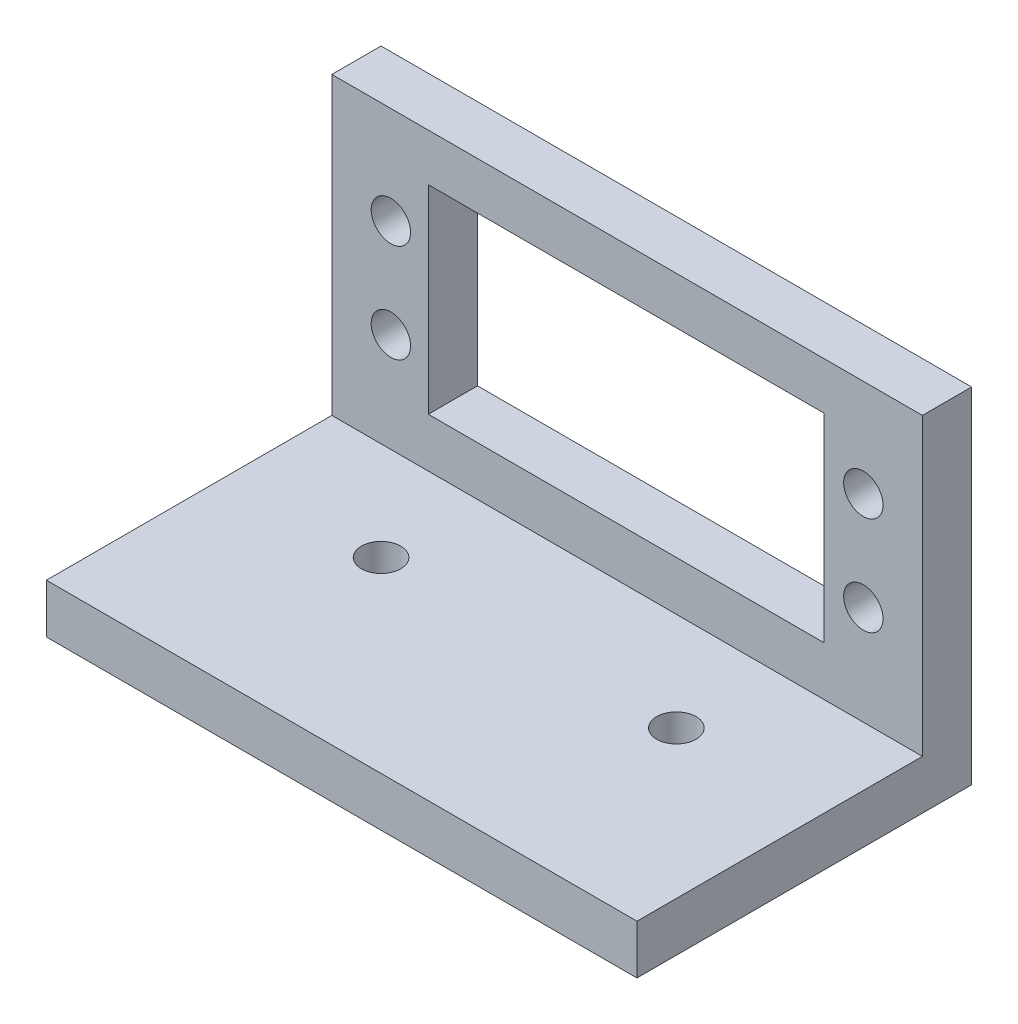
ISO-10303-21;
HEADER;
FILE_DESCRIPTION(('STEP AP214'),'2;1');
FILE_NAME('part.step','',(''),(''),'','','');
FILE_SCHEMA(('AUTOMOTIVE_DESIGN { 1 0 10303 214 1 1 1 1 }'));
ENDSEC;
DATA;
#1=APPLICATION_CONTEXT('core data for automotive mechanical design processes');
#2=APPLICATION_PROTOCOL_DEFINITION('international standard','automotive_design',2000,#1);
#3=PRODUCT_CONTEXT('',#1,'mechanical');
#4=PRODUCT('Part','Part','',(#3));
#5=PRODUCT_RELATED_PRODUCT_CATEGORY('part','',(#4));
#6=PRODUCT_DEFINITION_FORMATION('','',#4);
#7=PRODUCT_DEFINITION_CONTEXT('part definition',#1,'design');
#8=PRODUCT_DEFINITION('design','',#6,#7);
#9=PRODUCT_DEFINITION_SHAPE('','',#8);
#10=(LENGTH_UNIT() NAMED_UNIT(*) SI_UNIT(.MILLI.,.METRE.));
#11=(NAMED_UNIT(*) PLANE_ANGLE_UNIT() SI_UNIT($,.RADIAN.));
#12=(NAMED_UNIT(*) SI_UNIT($,.STERADIAN.) SOLID_ANGLE_UNIT());
#13=UNCERTAINTY_MEASURE_WITH_UNIT(LENGTH_MEASURE(1.E-05),#10,'distance_accuracy_value','');
#14=(GEOMETRIC_REPRESENTATION_CONTEXT(3) GLOBAL_UNCERTAINTY_ASSIGNED_CONTEXT((#13)) GLOBAL_UNIT_ASSIGNED_CONTEXT((#10,
#11,#12)) REPRESENTATION_CONTEXT('',''));
#15=CARTESIAN_POINT('',(0.,0.,0.));
#16=DIRECTION('',(0.,0.,1.));
#17=DIRECTION('',(1.,0.,0.));
#18=AXIS2_PLACEMENT_3D('',#15,#16,#17);
#19=CARTESIAN_POINT('',(0.,0.,5.));
#20=DIRECTION('',(0.,0.,1.));
#21=DIRECTION('',(1.,0.,0.));
#22=AXIS2_PLACEMENT_3D('',#19,#20,#21);
#23=PLANE('',#22);
#24=CARTESIAN_POINT('',(-26.0999999999999,5.60138495733142,5.));
#25=DIRECTION('',(0.,0.,1.));
#26=DIRECTION('',(1.,0.,0.));
#27=AXIS2_PLACEMENT_3D('',#24,#25,#26);
#28=CIRCLE('',#27,2.);
#29=CARTESIAN_POINT('',(-24.0999999999999,5.60138495733142,5.));
#30=VERTEX_POINT('',#29);
#31=EDGE_CURVE('E454',#30,#30,#28,.T.);
#32=ORIENTED_EDGE('',*,*,#31,.F.);
#33=EDGE_LOOP('',(#32));
#34=FACE_BOUND('',#33,.T.);
#35=CARTESIAN_POINT('',(-26.0999999999999,-4.39861504266858,5.));
#36=DIRECTION('',(0.,0.,1.));
#37=DIRECTION('',(1.,0.,0.));
#38=AXIS2_PLACEMENT_3D('',#35,#36,#37);
#39=CIRCLE('',#38,2.);
#40=CARTESIAN_POINT('',(-24.0999999999999,-4.39861504266858,5.));
#41=VERTEX_POINT('',#40);
#42=EDGE_CURVE('E458',#41,#41,#39,.T.);
#43=ORIENTED_EDGE('',*,*,#42,.F.);
#44=EDGE_LOOP('',(#43));
#45=FACE_BOUND('',#44,.T.);
#46=CARTESIAN_POINT('',(21.9000000000001,-4.39861504266858,5.));
#47=DIRECTION('',(0.,0.,1.));
#48=DIRECTION('',(1.,0.,0.));
#49=AXIS2_PLACEMENT_3D('',#46,#47,#48);
#50=CIRCLE('',#49,2.);
#51=CARTESIAN_POINT('',(23.9000000000001,-4.39861504266858,5.));
#52=VERTEX_POINT('',#51);
#53=EDGE_CURVE('E472',#52,#52,#50,.T.);
#54=ORIENTED_EDGE('',*,*,#53,.F.);
#55=EDGE_LOOP('',(#54));
#56=FACE_BOUND('',#55,.T.);
#57=CARTESIAN_POINT('',(21.9000000000001,5.60138495733142,5.));
#58=DIRECTION('',(0.,0.,1.));
#59=DIRECTION('',(1.,0.,0.));
#60=AXIS2_PLACEMENT_3D('',#57,#58,#59);
#61=CIRCLE('',#60,2.);
#62=CARTESIAN_POINT('',(23.9000000000001,5.60138495733142,5.));
#63=VERTEX_POINT('',#62);
#64=EDGE_CURVE('E239',#63,#63,#61,.T.);
#65=ORIENTED_EDGE('',*,*,#64,.F.);
#66=EDGE_LOOP('',(#65));
#67=FACE_BOUND('',#66,.T.);
#68=DIRECTION('',(-1.,0.,0.));
#69=VECTOR('',#68,1.);
#70=CARTESIAN_POINT('',(-32.0999999999998,-14.4986150426686,5.));
#71=LINE('',#70,#69);
#72=CARTESIAN_POINT('',(27.9000000000001,-14.4986150426686,5.));
#73=VERTEX_POINT('',#72);
#74=CARTESIAN_POINT('',(-32.0999999999998,-14.4986150426686,5.));
#75=VERTEX_POINT('',#74);
#76=EDGE_CURVE('E57',#73,#75,#71,.T.);
#77=ORIENTED_EDGE('',*,*,#76,.F.);
#78=DIRECTION('',(0.,1.,0.));
#79=VECTOR('',#78,1.);
#80=CARTESIAN_POINT('',(27.9000000000001,15.5013849573314,5.));
#81=LINE('',#80,#79);
#82=CARTESIAN_POINT('',(27.9000000000001,15.5013849573314,5.));
#83=VERTEX_POINT('',#82);
#84=EDGE_CURVE('E198',#73,#83,#81,.T.);
#85=ORIENTED_EDGE('',*,*,#84,.T.);
#86=DIRECTION('',(-1.,0.,0.));
#87=VECTOR('',#86,1.);
#88=CARTESIAN_POINT('',(-32.0999999999998,15.5013849573314,5.));
#89=LINE('',#88,#87);
#90=CARTESIAN_POINT('',(-32.0999999999998,15.5013849573314,5.));
#91=VERTEX_POINT('',#90);
#92=EDGE_CURVE('E121',#83,#91,#89,.T.);
#93=ORIENTED_EDGE('',*,*,#92,.T.);
#94=DIRECTION('',(0.,-1.,0.));
#95=VECTOR('',#94,1.);
#96=CARTESIAN_POINT('',(-32.0999999999998,15.5013849573314,5.));
#97=LINE('',#96,#95);
#98=EDGE_CURVE('E117',#91,#75,#97,.T.);
#99=ORIENTED_EDGE('',*,*,#98,.T.);
#100=EDGE_LOOP('',(#77,#85,#93,#99));
#101=FACE_BOUND('',#100,.T.);
#102=DIRECTION('',(-1.,0.,0.));
#103=VECTOR('',#102,1.);
#104=CARTESIAN_POINT('',(-22.2999999999999,10.7013849573314,5.));
#105=LINE('',#104,#103);
#106=CARTESIAN_POINT('',(17.9000000000001,10.7013849573314,5.));
#107=VERTEX_POINT('',#106);
#108=CARTESIAN_POINT('',(-22.2999999999999,10.7013849573314,5.));
#109=VERTEX_POINT('',#108);
#110=EDGE_CURVE('E159',#107,#109,#105,.T.);
#111=ORIENTED_EDGE('',*,*,#110,.F.);
#112=DIRECTION('',(0.,1.,0.));
#113=VECTOR('',#112,1.);
#114=CARTESIAN_POINT('',(17.9000000000001,10.7013849573314,5.));
#115=LINE('',#114,#113);
#116=CARTESIAN_POINT('',(17.9000000000001,-9.49861504266863,5.));
#117=VERTEX_POINT('',#116);
#118=EDGE_CURVE('E156',#117,#107,#115,.T.);
#119=ORIENTED_EDGE('',*,*,#118,.F.);
#120=DIRECTION('',(1.,0.,0.));
#121=VECTOR('',#120,1.);
#122=CARTESIAN_POINT('',(-22.2999999999999,-9.49861504266863,5.));
#123=LINE('',#122,#121);
#124=CARTESIAN_POINT('',(-22.2999999999999,-9.49861504266863,5.));
#125=VERTEX_POINT('',#124);
#126=EDGE_CURVE('E166',#125,#117,#123,.T.);
#127=ORIENTED_EDGE('',*,*,#126,.F.);
#128=DIRECTION('',(0.,-1.,0.));
#129=VECTOR('',#128,1.);
#130=CARTESIAN_POINT('',(-22.2999999999999,10.7013849573314,5.));
#131=LINE('',#130,#129);
#132=EDGE_CURVE('E163',#109,#125,#131,.T.);
#133=ORIENTED_EDGE('',*,*,#132,.F.);
#134=EDGE_LOOP('',(#111,#119,#127,#133));
#135=FACE_BOUND('',#134,.T.);
#136=ADVANCED_FACE('F39',(#34,#45,#56,#67,#101,#135),#23,.T.);
#137=CARTESIAN_POINT('',(0.,0.,0.));
#138=DIRECTION('',(0.,0.,1.));
#139=DIRECTION('',(1.,0.,0.));
#140=AXIS2_PLACEMENT_3D('',#137,#138,#139);
#141=PLANE('',#140);
#142=CARTESIAN_POINT('',(-26.0999999999999,5.60138495733142,0.));
#143=DIRECTION('',(0.,0.,1.));
#144=DIRECTION('',(1.,0.,0.));
#145=AXIS2_PLACEMENT_3D('',#142,#143,#144);
#146=CIRCLE('',#145,2.);
#147=CARTESIAN_POINT('',(-24.0999999999999,5.60138495733142,0.));
#148=VERTEX_POINT('',#147);
#149=EDGE_CURVE('E452',#148,#148,#146,.T.);
#150=ORIENTED_EDGE('',*,*,#149,.T.);
#151=EDGE_LOOP('',(#150));
#152=FACE_BOUND('',#151,.T.);
#153=CARTESIAN_POINT('',(-26.0999999999999,-4.39861504266858,0.));
#154=DIRECTION('',(0.,0.,1.));
#155=DIRECTION('',(1.,0.,0.));
#156=AXIS2_PLACEMENT_3D('',#153,#154,#155);
#157=CIRCLE('',#156,2.);
#158=CARTESIAN_POINT('',(-24.0999999999999,-4.39861504266858,0.));
#159=VERTEX_POINT('',#158);
#160=EDGE_CURVE('E478',#159,#159,#157,.T.);
#161=ORIENTED_EDGE('',*,*,#160,.T.);
#162=EDGE_LOOP('',(#161));
#163=FACE_BOUND('',#162,.T.);
#164=CARTESIAN_POINT('',(21.9000000000001,-4.39861504266858,0.));
#165=DIRECTION('',(0.,0.,1.));
#166=DIRECTION('',(1.,0.,0.));
#167=AXIS2_PLACEMENT_3D('',#164,#165,#166);
#168=CIRCLE('',#167,2.);
#169=CARTESIAN_POINT('',(23.9000000000001,-4.39861504266858,0.));
#170=VERTEX_POINT('',#169);
#171=EDGE_CURVE('E467',#170,#170,#168,.T.);
#172=ORIENTED_EDGE('',*,*,#171,.T.);
#173=EDGE_LOOP('',(#172));
#174=FACE_BOUND('',#173,.T.);
#175=CARTESIAN_POINT('',(21.9000000000001,5.60138495733142,0.));
#176=DIRECTION('',(0.,0.,1.));
#177=DIRECTION('',(1.,0.,0.));
#178=AXIS2_PLACEMENT_3D('',#175,#176,#177);
#179=CIRCLE('',#178,2.);
#180=CARTESIAN_POINT('',(23.9000000000001,5.60138495733142,0.));
#181=VERTEX_POINT('',#180);
#182=EDGE_CURVE('E236',#181,#181,#179,.T.);
#183=ORIENTED_EDGE('',*,*,#182,.T.);
#184=EDGE_LOOP('',(#183));
#185=FACE_BOUND('',#184,.T.);
#186=DIRECTION('',(0.,1.,0.));
#187=VECTOR('',#186,1.);
#188=CARTESIAN_POINT('',(27.9000000000001,15.5013849573314,0.));
#189=LINE('',#188,#187);
#190=CARTESIAN_POINT('',(27.9000000000001,-19.4986150426686,0.));
#191=VERTEX_POINT('',#190);
#192=CARTESIAN_POINT('',(27.9000000000001,15.5013849573314,0.));
#193=VERTEX_POINT('',#192);
#194=EDGE_CURVE('E197',#191,#193,#189,.T.);
#195=ORIENTED_EDGE('',*,*,#194,.F.);
#196=DIRECTION('',(1.,0.,0.));
#197=VECTOR('',#196,1.);
#198=CARTESIAN_POINT('',(-32.0999999999998,-19.4986150426686,0.));
#199=LINE('',#198,#197);
#200=CARTESIAN_POINT('',(-32.0999999999998,-19.4986150426686,0.));
#201=VERTEX_POINT('',#200);
#202=EDGE_CURVE('E201',#201,#191,#199,.T.);
#203=ORIENTED_EDGE('',*,*,#202,.F.);
#204=DIRECTION('',(0.,-1.,0.));
#205=VECTOR('',#204,1.);
#206=CARTESIAN_POINT('',(-32.0999999999998,15.5013849573314,0.));
#207=LINE('',#206,#205);
#208=CARTESIAN_POINT('',(-32.0999999999998,15.5013849573314,0.));
#209=VERTEX_POINT('',#208);
#210=EDGE_CURVE('E210',#209,#201,#207,.T.);
#211=ORIENTED_EDGE('',*,*,#210,.F.);
#212=DIRECTION('',(-1.,0.,0.));
#213=VECTOR('',#212,1.);
#214=CARTESIAN_POINT('',(-32.0999999999998,15.5013849573314,0.));
#215=LINE('',#214,#213);
#216=EDGE_CURVE('E207',#193,#209,#215,.T.);
#217=ORIENTED_EDGE('',*,*,#216,.F.);
#218=EDGE_LOOP('',(#195,#203,#211,#217));
#219=FACE_BOUND('',#218,.T.);
#220=DIRECTION('',(0.,1.,0.));
#221=VECTOR('',#220,1.);
#222=CARTESIAN_POINT('',(17.9000000000001,10.7013849573314,0.));
#223=LINE('',#222,#221);
#224=CARTESIAN_POINT('',(17.9000000000001,-9.49861504266863,0.));
#225=VERTEX_POINT('',#224);
#226=CARTESIAN_POINT('',(17.9000000000001,10.7013849573314,0.));
#227=VERTEX_POINT('',#226);
#228=EDGE_CURVE('E170',#225,#227,#223,.T.);
#229=ORIENTED_EDGE('',*,*,#228,.T.);
#230=DIRECTION('',(-1.,0.,0.));
#231=VECTOR('',#230,1.);
#232=CARTESIAN_POINT('',(-22.2999999999999,10.7013849573314,0.));
#233=LINE('',#232,#231);
#234=CARTESIAN_POINT('',(-22.2999999999999,10.7013849573314,0.));
#235=VERTEX_POINT('',#234);
#236=EDGE_CURVE('E174',#227,#235,#233,.T.);
#237=ORIENTED_EDGE('',*,*,#236,.T.);
#238=DIRECTION('',(0.,-1.,0.));
#239=VECTOR('',#238,1.);
#240=CARTESIAN_POINT('',(-22.2999999999999,10.7013849573314,0.));
#241=LINE('',#240,#239);
#242=CARTESIAN_POINT('',(-22.2999999999999,-9.49861504266863,0.));
#243=VERTEX_POINT('',#242);
#244=EDGE_CURVE('E178',#235,#243,#241,.T.);
#245=ORIENTED_EDGE('',*,*,#244,.T.);
#246=DIRECTION('',(1.,0.,0.));
#247=VECTOR('',#246,1.);
#248=CARTESIAN_POINT('',(-22.2999999999999,-9.49861504266863,0.));
#249=LINE('',#248,#247);
#250=EDGE_CURVE('E160',#243,#225,#249,.T.);
#251=ORIENTED_EDGE('',*,*,#250,.T.);
#252=EDGE_LOOP('',(#229,#237,#245,#251));
#253=FACE_BOUND('',#252,.T.);
#254=ADVANCED_FACE('F261',(#152,#163,#174,#185,#219,#253),#141,.F.);
#255=CARTESIAN_POINT('',(27.9000000000001,15.5013849573314,5.));
#256=DIRECTION('',(-1.,0.,0.));
#257=DIRECTION('',(0.,-1.,0.));
#258=AXIS2_PLACEMENT_3D('',#255,#256,#257);
#259=PLANE('',#258);
#260=ORIENTED_EDGE('',*,*,#194,.T.);
#261=DIRECTION('',(0.,0.,-1.));
#262=VECTOR('',#261,1.);
#263=CARTESIAN_POINT('',(27.9000000000001,15.5013849573314,5.));
#264=LINE('',#263,#262);
#265=EDGE_CURVE('E11',#83,#193,#264,.T.);
#266=ORIENTED_EDGE('',*,*,#265,.F.);
#267=ORIENTED_EDGE('',*,*,#84,.F.);
#268=DIRECTION('',(0.,0.,-1.));
#269=VECTOR('',#268,1.);
#270=CARTESIAN_POINT('',(27.9000000000001,-14.4986150426686,94.2079728939614));
#271=LINE('',#270,#269);
#272=CARTESIAN_POINT('',(27.9000000000001,-14.4986150426686,34.));
#273=VERTEX_POINT('',#272);
#274=EDGE_CURVE('E137',#273,#73,#271,.T.);
#275=ORIENTED_EDGE('',*,*,#274,.F.);
#276=DIRECTION('',(0.,-1.,0.));
#277=VECTOR('',#276,1.);
#278=CARTESIAN_POINT('',(27.9000000000001,-19.4986150426686,34.));
#279=LINE('',#278,#277);
#280=CARTESIAN_POINT('',(27.9000000000001,-19.4986150426686,34.));
#281=VERTEX_POINT('',#280);
#282=EDGE_CURVE('E155',#273,#281,#279,.T.);
#283=ORIENTED_EDGE('',*,*,#282,.T.);
#284=DIRECTION('',(0.,0.,-1.));
#285=VECTOR('',#284,1.);
#286=CARTESIAN_POINT('',(27.9000000000001,-19.4986150426686,5.));
#287=LINE('',#286,#285);
#288=EDGE_CURVE('E126',#281,#191,#287,.T.);
#289=ORIENTED_EDGE('',*,*,#288,.T.);
#290=EDGE_LOOP('',(#260,#266,#267,#275,#283,#289));
#291=FACE_BOUND('',#290,.T.);
#292=ADVANCED_FACE('F41',(#291),#259,.F.);
#293=CARTESIAN_POINT('',(-32.0999999999998,15.5013849573314,5.));
#294=DIRECTION('',(0.,-1.,0.));
#295=DIRECTION('',(0.,0.,-1.));
#296=AXIS2_PLACEMENT_3D('',#293,#294,#295);
#297=PLANE('',#296);
#298=ORIENTED_EDGE('',*,*,#216,.T.);
#299=DIRECTION('',(0.,0.,-1.));
#300=VECTOR('',#299,1.);
#301=CARTESIAN_POINT('',(-32.0999999999998,15.5013849573314,5.));
#302=LINE('',#301,#300);
#303=EDGE_CURVE('E49',#91,#209,#302,.T.);
#304=ORIENTED_EDGE('',*,*,#303,.F.);
#305=ORIENTED_EDGE('',*,*,#92,.F.);
#306=ORIENTED_EDGE('',*,*,#265,.T.);
#307=EDGE_LOOP('',(#298,#304,#305,#306));
#308=FACE_BOUND('',#307,.T.);
#309=ADVANCED_FACE('F258',(#308),#297,.F.);
#310=CARTESIAN_POINT('',(-32.0999999999998,15.5013849573314,5.));
#311=DIRECTION('',(1.,0.,0.));
#312=DIRECTION('',(0.,1.,0.));
#313=AXIS2_PLACEMENT_3D('',#310,#311,#312);
#314=PLANE('',#313);
#315=ORIENTED_EDGE('',*,*,#210,.T.);
#316=DIRECTION('',(0.,0.,-1.));
#317=VECTOR('',#316,1.);
#318=CARTESIAN_POINT('',(-32.0999999999998,-19.4986150426686,5.));
#319=LINE('',#318,#317);
#320=CARTESIAN_POINT('',(-32.0999999999998,-19.4986150426686,34.));
#321=VERTEX_POINT('',#320);
#322=EDGE_CURVE('E218',#321,#201,#319,.T.);
#323=ORIENTED_EDGE('',*,*,#322,.F.);
#324=DIRECTION('',(0.,1.,0.));
#325=VECTOR('',#324,1.);
#326=CARTESIAN_POINT('',(-32.0999999999998,-19.4986150426686,34.));
#327=LINE('',#326,#325);
#328=CARTESIAN_POINT('',(-32.0999999999998,-14.4986150426686,34.));
#329=VERTEX_POINT('',#328);
#330=EDGE_CURVE('E133',#321,#329,#327,.T.);
#331=ORIENTED_EDGE('',*,*,#330,.T.);
#332=DIRECTION('',(0.,0.,-1.));
#333=VECTOR('',#332,1.);
#334=CARTESIAN_POINT('',(-32.0999999999998,-14.4986150426686,94.2079728939614));
#335=LINE('',#334,#333);
#336=EDGE_CURVE('E130',#329,#75,#335,.T.);
#337=ORIENTED_EDGE('',*,*,#336,.T.);
#338=ORIENTED_EDGE('',*,*,#98,.F.);
#339=ORIENTED_EDGE('',*,*,#303,.T.);
#340=EDGE_LOOP('',(#315,#323,#331,#337,#338,#339));
#341=FACE_BOUND('',#340,.T.);
#342=ADVANCED_FACE('F131',(#341),#314,.F.);
#343=CARTESIAN_POINT('',(-32.0999999999998,-19.4986150426686,5.));
#344=DIRECTION('',(0.,1.,0.));
#345=DIRECTION('',(-1.,0.,0.));
#346=AXIS2_PLACEMENT_3D('',#343,#344,#345);
#347=PLANE('',#346);
#348=CARTESIAN_POINT('',(-17.0999999999999,-19.4986150426686,15.));
#349=DIRECTION('',(0.,-1.,0.));
#350=DIRECTION('',(0.,0.,-1.));
#351=AXIS2_PLACEMENT_3D('',#348,#349,#350);
#352=CIRCLE('',#351,2.);
#353=CARTESIAN_POINT('',(-17.0999999999999,-19.4986150426686,13.));
#354=VERTEX_POINT('',#353);
#355=EDGE_CURVE('E225',#354,#354,#352,.T.);
#356=ORIENTED_EDGE('',*,*,#355,.F.);
#357=EDGE_LOOP('',(#356));
#358=FACE_BOUND('',#357,.T.);
#359=CARTESIAN_POINT('',(12.9000000000001,-19.4986150426686,15.));
#360=DIRECTION('',(0.,-1.,0.));
#361=DIRECTION('',(0.,0.,-1.));
#362=AXIS2_PLACEMENT_3D('',#359,#360,#361);
#363=CIRCLE('',#362,2.);
#364=CARTESIAN_POINT('',(12.9000000000001,-19.4986150426686,13.));
#365=VERTEX_POINT('',#364);
#366=EDGE_CURVE('E230',#365,#365,#363,.T.);
#367=ORIENTED_EDGE('',*,*,#366,.F.);
#368=EDGE_LOOP('',(#367));
#369=FACE_BOUND('',#368,.T.);
#370=ORIENTED_EDGE('',*,*,#202,.T.);
#371=ORIENTED_EDGE('',*,*,#288,.F.);
#372=DIRECTION('',(-1.,0.,0.));
#373=VECTOR('',#372,1.);
#374=CARTESIAN_POINT('',(-32.0999999999998,-19.4986150426686,34.));
#375=LINE('',#374,#373);
#376=EDGE_CURVE('E244',#281,#321,#375,.T.);
#377=ORIENTED_EDGE('',*,*,#376,.T.);
#378=ORIENTED_EDGE('',*,*,#322,.T.);
#379=EDGE_LOOP('',(#370,#371,#377,#378));
#380=FACE_BOUND('',#379,.T.);
#381=ADVANCED_FACE('F250',(#358,#369,#380),#347,.F.);
#382=CARTESIAN_POINT('',(17.9000000000001,10.7013849573314,5.));
#383=DIRECTION('',(-1.,0.,0.));
#384=DIRECTION('',(0.,-1.,0.));
#385=AXIS2_PLACEMENT_3D('',#382,#383,#384);
#386=PLANE('',#385);
#387=ORIENTED_EDGE('',*,*,#228,.F.);
#388=DIRECTION('',(0.,0.,-1.));
#389=VECTOR('',#388,1.);
#390=CARTESIAN_POINT('',(17.9000000000001,-9.49861504266863,5.));
#391=LINE('',#390,#389);
#392=EDGE_CURVE('E169',#117,#225,#391,.T.);
#393=ORIENTED_EDGE('',*,*,#392,.F.);
#394=ORIENTED_EDGE('',*,*,#118,.T.);
#395=DIRECTION('',(0.,0.,-1.));
#396=VECTOR('',#395,1.);
#397=CARTESIAN_POINT('',(17.9000000000001,10.7013849573314,5.));
#398=LINE('',#397,#396);
#399=EDGE_CURVE('E193',#107,#227,#398,.T.);
#400=ORIENTED_EDGE('',*,*,#399,.T.);
#401=EDGE_LOOP('',(#387,#393,#394,#400));
#402=FACE_BOUND('',#401,.T.);
#403=ADVANCED_FACE('F268',(#402),#386,.T.);
#404=CARTESIAN_POINT('',(-22.2999999999999,10.7013849573314,5.));
#405=DIRECTION('',(0.,-1.,0.));
#406=DIRECTION('',(0.,0.,-1.));
#407=AXIS2_PLACEMENT_3D('',#404,#405,#406);
#408=PLANE('',#407);
#409=ORIENTED_EDGE('',*,*,#236,.F.);
#410=ORIENTED_EDGE('',*,*,#399,.F.);
#411=ORIENTED_EDGE('',*,*,#110,.T.);
#412=DIRECTION('',(0.,0.,-1.));
#413=VECTOR('',#412,1.);
#414=CARTESIAN_POINT('',(-22.2999999999999,10.7013849573314,5.));
#415=LINE('',#414,#413);
#416=EDGE_CURVE('E190',#109,#235,#415,.T.);
#417=ORIENTED_EDGE('',*,*,#416,.T.);
#418=EDGE_LOOP('',(#409,#410,#411,#417));
#419=FACE_BOUND('',#418,.T.);
#420=ADVANCED_FACE('F276',(#419),#408,.T.);
#421=CARTESIAN_POINT('',(-22.2999999999999,10.7013849573314,5.));
#422=DIRECTION('',(1.,0.,0.));
#423=DIRECTION('',(0.,1.,0.));
#424=AXIS2_PLACEMENT_3D('',#421,#422,#423);
#425=PLANE('',#424);
#426=ORIENTED_EDGE('',*,*,#244,.F.);
#427=ORIENTED_EDGE('',*,*,#416,.F.);
#428=ORIENTED_EDGE('',*,*,#132,.T.);
#429=DIRECTION('',(0.,0.,-1.));
#430=VECTOR('',#429,1.);
#431=CARTESIAN_POINT('',(-22.2999999999999,-9.49861504266863,5.));
#432=LINE('',#431,#430);
#433=EDGE_CURVE('E65',#125,#243,#432,.T.);
#434=ORIENTED_EDGE('',*,*,#433,.T.);
#435=EDGE_LOOP('',(#426,#427,#428,#434));
#436=FACE_BOUND('',#435,.T.);
#437=ADVANCED_FACE('F280',(#436),#425,.T.);
#438=CARTESIAN_POINT('',(-22.2999999999999,-9.49861504266863,5.));
#439=DIRECTION('',(0.,1.,0.));
#440=DIRECTION('',(0.,0.,1.));
#441=AXIS2_PLACEMENT_3D('',#438,#439,#440);
#442=PLANE('',#441);
#443=ORIENTED_EDGE('',*,*,#250,.F.);
#444=ORIENTED_EDGE('',*,*,#433,.F.);
#445=ORIENTED_EDGE('',*,*,#126,.T.);
#446=ORIENTED_EDGE('',*,*,#392,.T.);
#447=EDGE_LOOP('',(#443,#444,#445,#446));
#448=FACE_BOUND('',#447,.T.);
#449=ADVANCED_FACE('F271',(#448),#442,.T.);
#450=CARTESIAN_POINT('',(-32.0999999999998,-14.4986150426686,94.2079728939614));
#451=DIRECTION('',(0.,-1.,0.));
#452=DIRECTION('',(0.,0.,-1.));
#453=AXIS2_PLACEMENT_3D('',#450,#451,#452);
#454=PLANE('',#453);
#455=CARTESIAN_POINT('',(-17.0999999999999,-14.4986150426686,15.));
#456=DIRECTION('',(0.,-1.,0.));
#457=DIRECTION('',(0.,0.,-1.));
#458=AXIS2_PLACEMENT_3D('',#455,#456,#457);
#459=CIRCLE('',#458,2.);
#460=CARTESIAN_POINT('',(-17.0999999999999,-14.4986150426686,13.));
#461=VERTEX_POINT('',#460);
#462=EDGE_CURVE('E43',#461,#461,#459,.T.);
#463=ORIENTED_EDGE('',*,*,#462,.T.);
#464=EDGE_LOOP('',(#463));
#465=FACE_BOUND('',#464,.T.);
#466=CARTESIAN_POINT('',(12.9000000000001,-14.4986150426686,15.));
#467=DIRECTION('',(0.,-1.,0.));
#468=DIRECTION('',(0.,0.,-1.));
#469=AXIS2_PLACEMENT_3D('',#466,#467,#468);
#470=CIRCLE('',#469,2.);
#471=CARTESIAN_POINT('',(12.9000000000001,-14.4986150426686,13.));
#472=VERTEX_POINT('',#471);
#473=EDGE_CURVE('E146',#472,#472,#470,.T.);
#474=ORIENTED_EDGE('',*,*,#473,.T.);
#475=EDGE_LOOP('',(#474));
#476=FACE_BOUND('',#475,.T.);
#477=ORIENTED_EDGE('',*,*,#336,.F.);
#478=DIRECTION('',(1.,0.,0.));
#479=VECTOR('',#478,1.);
#480=CARTESIAN_POINT('',(-32.0999999999998,-14.4986150426686,34.));
#481=LINE('',#480,#479);
#482=EDGE_CURVE('E152',#329,#273,#481,.T.);
#483=ORIENTED_EDGE('',*,*,#482,.T.);
#484=ORIENTED_EDGE('',*,*,#274,.T.);
#485=ORIENTED_EDGE('',*,*,#76,.T.);
#486=EDGE_LOOP('',(#477,#483,#484,#485));
#487=FACE_BOUND('',#486,.T.);
#488=ADVANCED_FACE('F140',(#465,#476,#487),#454,.F.);
#489=CARTESIAN_POINT('',(-2.09999999999987,0.601384957331419,34.));
#490=DIRECTION('',(0.,0.,-1.));
#491=DIRECTION('',(1.,0.,0.));
#492=AXIS2_PLACEMENT_3D('',#489,#490,#491);
#493=PLANE('',#492);
#494=ORIENTED_EDGE('',*,*,#376,.F.);
#495=ORIENTED_EDGE('',*,*,#282,.F.);
#496=ORIENTED_EDGE('',*,*,#482,.F.);
#497=ORIENTED_EDGE('',*,*,#330,.F.);
#498=EDGE_LOOP('',(#494,#495,#496,#497));
#499=FACE_BOUND('',#498,.T.);
#500=ADVANCED_FACE('F253',(#499),#493,.F.);
#501=CARTESIAN_POINT('',(12.9000000000001,-3.84176079317625,15.));
#502=DIRECTION('',(0.,-1.,0.));
#503=DIRECTION('',(0.,0.,-1.));
#504=AXIS2_PLACEMENT_3D('',#501,#502,#503);
#505=CYLINDRICAL_SURFACE('',#504,2.);
#506=ORIENTED_EDGE('',*,*,#366,.T.);
#507=EDGE_LOOP('',(#506));
#508=FACE_BOUND('',#507,.T.);
#509=ORIENTED_EDGE('',*,*,#473,.F.);
#510=EDGE_LOOP('',(#509));
#511=FACE_BOUND('',#510,.T.);
#512=ADVANCED_FACE('F369',(#508,#511),#505,.F.);
#513=CARTESIAN_POINT('',(-17.0999999999999,-3.84176079317625,15.));
#514=DIRECTION('',(0.,-1.,0.));
#515=DIRECTION('',(0.,0.,-1.));
#516=AXIS2_PLACEMENT_3D('',#513,#514,#515);
#517=CYLINDRICAL_SURFACE('',#516,2.);
#518=ORIENTED_EDGE('',*,*,#355,.T.);
#519=EDGE_LOOP('',(#518));
#520=FACE_BOUND('',#519,.T.);
#521=ORIENTED_EDGE('',*,*,#462,.F.);
#522=EDGE_LOOP('',(#521));
#523=FACE_BOUND('',#522,.T.);
#524=ADVANCED_FACE('F329',(#520,#523),#517,.F.);
#525=CARTESIAN_POINT('',(21.9000000000001,5.60138495733142,0.));
#526=DIRECTION('',(0.,0.,1.));
#527=DIRECTION('',(1.,0.,0.));
#528=AXIS2_PLACEMENT_3D('',#525,#526,#527);
#529=CYLINDRICAL_SURFACE('',#528,2.);
#530=ORIENTED_EDGE('',*,*,#182,.F.);
#531=EDGE_LOOP('',(#530));
#532=FACE_BOUND('',#531,.T.);
#533=ORIENTED_EDGE('',*,*,#64,.T.);
#534=EDGE_LOOP('',(#533));
#535=FACE_BOUND('',#534,.T.);
#536=ADVANCED_FACE('F323',(#532,#535),#529,.F.);
#537=CARTESIAN_POINT('',(21.9000000000001,-4.39861504266858,0.));
#538=DIRECTION('',(0.,0.,1.));
#539=DIRECTION('',(1.,0.,0.));
#540=AXIS2_PLACEMENT_3D('',#537,#538,#539);
#541=CYLINDRICAL_SURFACE('',#540,2.);
#542=ORIENTED_EDGE('',*,*,#171,.F.);
#543=EDGE_LOOP('',(#542));
#544=FACE_BOUND('',#543,.T.);
#545=ORIENTED_EDGE('',*,*,#53,.T.);
#546=EDGE_LOOP('',(#545));
#547=FACE_BOUND('',#546,.T.);
#548=ADVANCED_FACE('F328',(#544,#547),#541,.F.);
#549=CARTESIAN_POINT('',(-26.0999999999999,-4.39861504266858,0.));
#550=DIRECTION('',(0.,0.,1.));
#551=DIRECTION('',(1.,0.,0.));
#552=AXIS2_PLACEMENT_3D('',#549,#550,#551);
#553=CYLINDRICAL_SURFACE('',#552,2.);
#554=ORIENTED_EDGE('',*,*,#160,.F.);
#555=EDGE_LOOP('',(#554));
#556=FACE_BOUND('',#555,.T.);
#557=ORIENTED_EDGE('',*,*,#42,.T.);
#558=EDGE_LOOP('',(#557));
#559=FACE_BOUND('',#558,.T.);
#560=ADVANCED_FACE('F341',(#556,#559),#553,.F.);
#561=CARTESIAN_POINT('',(-26.0999999999999,5.60138495733142,0.));
#562=DIRECTION('',(0.,0.,1.));
#563=DIRECTION('',(1.,0.,0.));
#564=AXIS2_PLACEMENT_3D('',#561,#562,#563);
#565=CYLINDRICAL_SURFACE('',#564,2.);
#566=ORIENTED_EDGE('',*,*,#149,.F.);
#567=EDGE_LOOP('',(#566));
#568=FACE_BOUND('',#567,.T.);
#569=ORIENTED_EDGE('',*,*,#31,.T.);
#570=EDGE_LOOP('',(#569));
#571=FACE_BOUND('',#570,.T.);
#572=ADVANCED_FACE('F351',(#568,#571),#565,.F.);
#573=CLOSED_SHELL('',(#136,#254,#292,#309,#342,#381,#403,#420,#437,#449,#488,#500,#512,#524,
#536,#548,#560,#572));
#574=MANIFOLD_SOLID_BREP('B2',#573);
#575=ADVANCED_BREP_SHAPE_REPRESENTATION('',(#18,#574),#14);
#576=SHAPE_DEFINITION_REPRESENTATION(#9,#575);
ENDSEC;
END-ISO-10303-21;
